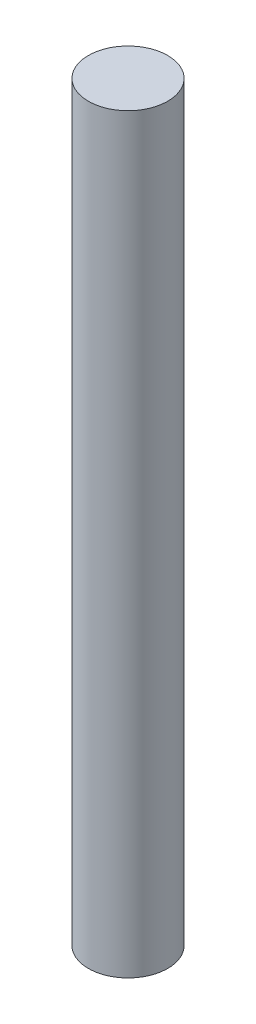
ISO-10303-21;
HEADER;
FILE_DESCRIPTION(('STEP AP214'),'2;1');
FILE_NAME('part.step','',(''),(''),'','','');
FILE_SCHEMA(('AUTOMOTIVE_DESIGN { 1 0 10303 214 1 1 1 1 }'));
ENDSEC;
DATA;
#1=APPLICATION_CONTEXT('core data for automotive mechanical design processes');
#2=APPLICATION_PROTOCOL_DEFINITION('international standard','automotive_design',2000,#1);
#3=PRODUCT_CONTEXT('',#1,'mechanical');
#4=PRODUCT('Part','Part','',(#3));
#5=PRODUCT_RELATED_PRODUCT_CATEGORY('part','',(#4));
#6=PRODUCT_DEFINITION_FORMATION('','',#4);
#7=PRODUCT_DEFINITION_CONTEXT('part definition',#1,'design');
#8=PRODUCT_DEFINITION('design','',#6,#7);
#9=PRODUCT_DEFINITION_SHAPE('','',#8);
#10=(LENGTH_UNIT() NAMED_UNIT(*) SI_UNIT(.MILLI.,.METRE.));
#11=(NAMED_UNIT(*) PLANE_ANGLE_UNIT() SI_UNIT($,.RADIAN.));
#12=(NAMED_UNIT(*) SI_UNIT($,.STERADIAN.) SOLID_ANGLE_UNIT());
#13=UNCERTAINTY_MEASURE_WITH_UNIT(LENGTH_MEASURE(1.E-05),#10,'distance_accuracy_value','');
#14=(GEOMETRIC_REPRESENTATION_CONTEXT(3) GLOBAL_UNCERTAINTY_ASSIGNED_CONTEXT((#13)) GLOBAL_UNIT_ASSIGNED_CONTEXT((#10,
#11,#12)) REPRESENTATION_CONTEXT('',''));
#15=CARTESIAN_POINT('',(0.,0.,0.));
#16=DIRECTION('',(0.,0.,1.));
#17=DIRECTION('',(1.,0.,0.));
#18=AXIS2_PLACEMENT_3D('',#15,#16,#17);
#19=CARTESIAN_POINT('',(0.,22.606,0.));
#20=DIRECTION('',(0.,-1.,0.));
#21=DIRECTION('',(0.,0.,-1.));
#22=AXIS2_PLACEMENT_3D('',#19,#20,#21);
#23=CYLINDRICAL_SURFACE('',#22,1.1938);
#24=CARTESIAN_POINT('',(0.,22.606,0.));
#25=DIRECTION('',(0.,1.,0.));
#26=DIRECTION('',(0.,0.,1.));
#27=AXIS2_PLACEMENT_3D('',#24,#25,#26);
#28=CIRCLE('',#27,1.1938);
#29=CARTESIAN_POINT('',(0.,22.606,-1.1938));
#30=VERTEX_POINT('',#29);
#31=EDGE_CURVE('E10',#30,#30,#28,.T.);
#32=CARTESIAN_POINT('',(0.,0.,0.));
#33=DIRECTION('',(0.,1.,0.));
#34=DIRECTION('',(0.,0.,1.));
#35=AXIS2_PLACEMENT_3D('',#32,#33,#34);
#36=CIRCLE('',#35,1.1938);
#37=CARTESIAN_POINT('',(0.,0.,-1.1938));
#38=VERTEX_POINT('',#37);
#39=EDGE_CURVE('E36',#38,#38,#36,.T.);
#40=CARTESIAN_POINT('',(0.,22.606,-1.1938));
#41=CARTESIAN_POINT('',(0.,22.3705208333333,-1.1938));
#42=CARTESIAN_POINT('',(0.,22.1350416666667,-1.1938));
#43=CARTESIAN_POINT('',(0.,21.6640833333333,-1.1938));
#44=CARTESIAN_POINT('',(0.,21.4286041666667,-1.1938));
#45=CARTESIAN_POINT('',(0.,20.9576458333333,-1.1938));
#46=CARTESIAN_POINT('',(0.,20.7221666666667,-1.1938));
#47=CARTESIAN_POINT('',(0.,20.2512083333333,-1.1938));
#48=CARTESIAN_POINT('',(0.,20.0157291666667,-1.1938));
#49=CARTESIAN_POINT('',(0.,19.5447708333333,-1.1938));
#50=CARTESIAN_POINT('',(0.,19.3092916666667,-1.1938));
#51=CARTESIAN_POINT('',(0.,18.8383333333333,-1.1938));
#52=CARTESIAN_POINT('',(0.,18.6028541666667,-1.1938));
#53=CARTESIAN_POINT('',(0.,18.1318958333333,-1.1938));
#54=CARTESIAN_POINT('',(0.,17.8964166666667,-1.1938));
#55=CARTESIAN_POINT('',(0.,17.4254583333333,-1.1938));
#56=CARTESIAN_POINT('',(0.,17.1899791666667,-1.1938));
#57=CARTESIAN_POINT('',(0.,16.7190208333333,-1.1938));
#58=CARTESIAN_POINT('',(0.,16.4835416666667,-1.1938));
#59=CARTESIAN_POINT('',(0.,16.0125833333333,-1.1938));
#60=CARTESIAN_POINT('',(0.,15.7771041666667,-1.1938));
#61=CARTESIAN_POINT('',(0.,15.3061458333333,-1.1938));
#62=CARTESIAN_POINT('',(0.,15.0706666666667,-1.1938));
#63=CARTESIAN_POINT('',(0.,14.5997083333333,-1.1938));
#64=CARTESIAN_POINT('',(0.,14.3642291666667,-1.1938));
#65=CARTESIAN_POINT('',(0.,13.8932708333333,-1.1938));
#66=CARTESIAN_POINT('',(0.,13.6577916666667,-1.1938));
#67=CARTESIAN_POINT('',(0.,13.1868333333333,-1.1938));
#68=CARTESIAN_POINT('',(0.,12.9513541666667,-1.1938));
#69=CARTESIAN_POINT('',(0.,12.4803958333333,-1.1938));
#70=CARTESIAN_POINT('',(0.,12.2449166666667,-1.1938));
#71=CARTESIAN_POINT('',(0.,11.7739583333333,-1.1938));
#72=CARTESIAN_POINT('',(0.,11.5384791666667,-1.1938));
#73=CARTESIAN_POINT('',(0.,11.0675208333333,-1.1938));
#74=CARTESIAN_POINT('',(0.,10.8320416666667,-1.1938));
#75=CARTESIAN_POINT('',(0.,10.3610833333333,-1.1938));
#76=CARTESIAN_POINT('',(0.,10.1256041666667,-1.1938));
#77=CARTESIAN_POINT('',(0.,9.65464583333333,-1.1938));
#78=CARTESIAN_POINT('',(0.,9.41916666666667,-1.1938));
#79=CARTESIAN_POINT('',(0.,8.94820833333333,-1.1938));
#80=CARTESIAN_POINT('',(0.,8.71272916666667,-1.1938));
#81=CARTESIAN_POINT('',(0.,8.24177083333333,-1.1938));
#82=CARTESIAN_POINT('',(0.,8.00629166666667,-1.1938));
#83=CARTESIAN_POINT('',(0.,7.53533333333333,-1.1938));
#84=CARTESIAN_POINT('',(0.,7.29985416666666,-1.1938));
#85=CARTESIAN_POINT('',(0.,6.82889583333333,-1.1938));
#86=CARTESIAN_POINT('',(0.,6.59341666666666,-1.1938));
#87=CARTESIAN_POINT('',(0.,6.12245833333333,-1.1938));
#88=CARTESIAN_POINT('',(0.,5.88697916666666,-1.1938));
#89=CARTESIAN_POINT('',(0.,5.41602083333333,-1.1938));
#90=CARTESIAN_POINT('',(0.,5.18054166666666,-1.1938));
#91=CARTESIAN_POINT('',(0.,4.70958333333333,-1.1938));
#92=CARTESIAN_POINT('',(0.,4.47410416666666,-1.1938));
#93=CARTESIAN_POINT('',(0.,4.00314583333333,-1.1938));
#94=CARTESIAN_POINT('',(0.,3.76766666666666,-1.1938));
#95=CARTESIAN_POINT('',(0.,3.29670833333333,-1.1938));
#96=CARTESIAN_POINT('',(0.,3.06122916666667,-1.1938));
#97=CARTESIAN_POINT('',(0.,2.59027083333333,-1.1938));
#98=CARTESIAN_POINT('',(0.,2.35479166666666,-1.1938));
#99=CARTESIAN_POINT('',(0.,1.88383333333333,-1.1938));
#100=CARTESIAN_POINT('',(0.,1.64835416666666,-1.1938));
#101=CARTESIAN_POINT('',(0.,1.17739583333333,-1.1938));
#102=CARTESIAN_POINT('',(0.,0.941916666666664,-1.1938));
#103=CARTESIAN_POINT('',(0.,0.47095833333333,-1.1938));
#104=CARTESIAN_POINT('',(0.,0.235479166666663,-1.1938));
#105=CARTESIAN_POINT('',(0.,0.,-1.1938));
#106=B_SPLINE_CURVE_WITH_KNOTS('',3,(#40,#41,#42,#43,#44,#45,#46,#47,#48,#49,#50,#51,#52,#53,
#54,#55,#56,#57,#58,#59,#60,#61,#62,#63,#64,#65,#66,#67,#68,#69,#70,#71,#72,#73,#74,#75,#76,#77,
#78,#79,#80,#81,#82,#83,#84,#85,#86,#87,#88,#89,#90,#91,#92,#93,#94,#95,#96,#97,#98,#99,#100,
#101,#102,#103,#104,#105),.UNSPECIFIED.,.F.,.F.,(4,2,2,2,2,2,2,2,2,2,2,2,2,2,2,2,2,2,2,2,2,2,2,
2,2,2,2,2,2,2,2,2,4),(0.,0.706437499999997,1.412875,2.1193125,2.82575,3.5321875,4.238625,
4.9450625,5.6515,6.3579375,7.064375,7.7708125,8.47725,9.1836875,9.890125,10.5965625,11.303,
12.0094375,12.715875,13.4223125,14.12875,14.8351875,15.541625,16.2480625,16.9545,17.6609375,
18.367375,19.0738125,19.78025,20.4866875,21.193125,21.8995625,22.606),.UNSPECIFIED.);
#107=EDGE_CURVE('BSEAM33',#30,#38,#106,.T.);
#108=ORIENTED_EDGE('',*,*,#31,.F.);
#109=ORIENTED_EDGE('',*,*,#39,.T.);
#110=ORIENTED_EDGE('',*,*,#107,.T.);
#111=ORIENTED_EDGE('',*,*,#107,.F.);
#112=EDGE_LOOP('',(#108,#110,#109,#111));
#113=FACE_BOUND('',#112,.T.);
#114=ADVANCED_FACE('F33',(#113),#23,.T.);
#115=CARTESIAN_POINT('',(0.,22.606,0.));
#116=DIRECTION('',(0.,1.,0.));
#117=DIRECTION('',(0.,0.,1.));
#118=AXIS2_PLACEMENT_3D('',#115,#116,#117);
#119=PLANE('',#118);
#120=ORIENTED_EDGE('',*,*,#31,.T.);
#121=EDGE_LOOP('',(#120));
#122=FACE_BOUND('',#121,.T.);
#123=ADVANCED_FACE('F48',(#122),#119,.T.);
#124=CARTESIAN_POINT('',(0.,0.,0.));
#125=DIRECTION('',(0.,1.,0.));
#126=DIRECTION('',(0.,0.,1.));
#127=AXIS2_PLACEMENT_3D('',#124,#125,#126);
#128=PLANE('',#127);
#129=ORIENTED_EDGE('',*,*,#39,.F.);
#130=EDGE_LOOP('',(#129));
#131=FACE_BOUND('',#130,.T.);
#132=ADVANCED_FACE('F46',(#131),#128,.F.);
#133=CLOSED_SHELL('',(#114,#123,#132));
#134=MANIFOLD_SOLID_BREP('B2',#133);
#135=ADVANCED_BREP_SHAPE_REPRESENTATION('',(#18,#134),#14);
#136=SHAPE_DEFINITION_REPRESENTATION(#9,#135);
ENDSEC;
END-ISO-10303-21;
